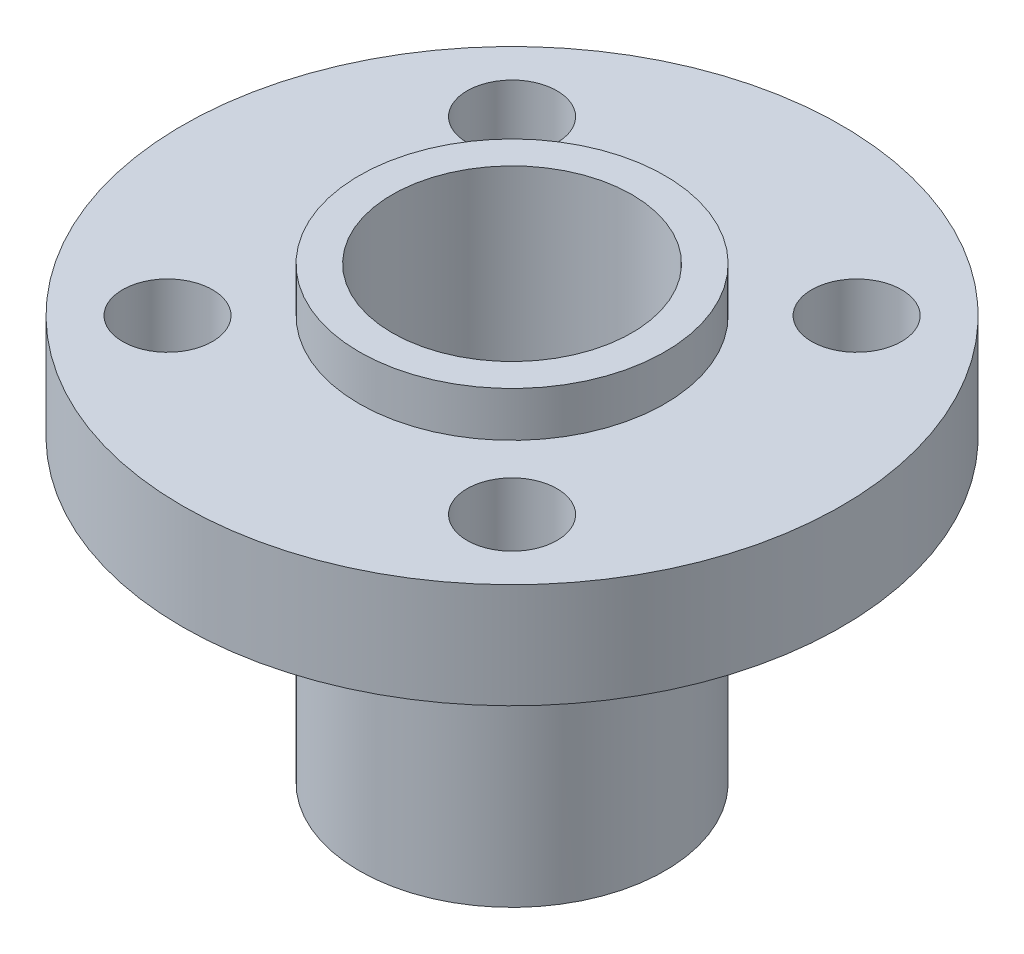
ISO-10303-21;
HEADER;
FILE_DESCRIPTION(('STEP AP214'),'2;1');
FILE_NAME('part.step','',(''),(''),'','','');
FILE_SCHEMA(('AUTOMOTIVE_DESIGN { 1 0 10303 214 1 1 1 1 }'));
ENDSEC;
DATA;
#1=APPLICATION_CONTEXT('core data for automotive mechanical design processes');
#2=APPLICATION_PROTOCOL_DEFINITION('international standard','automotive_design',2000,#1);
#3=PRODUCT_CONTEXT('',#1,'mechanical');
#4=PRODUCT('Part','Part','',(#3));
#5=PRODUCT_RELATED_PRODUCT_CATEGORY('part','',(#4));
#6=PRODUCT_DEFINITION_FORMATION('','',#4);
#7=PRODUCT_DEFINITION_CONTEXT('part definition',#1,'design');
#8=PRODUCT_DEFINITION('design','',#6,#7);
#9=PRODUCT_DEFINITION_SHAPE('','',#8);
#10=(LENGTH_UNIT() NAMED_UNIT(*) SI_UNIT(.MILLI.,.METRE.));
#11=(NAMED_UNIT(*) PLANE_ANGLE_UNIT() SI_UNIT($,.RADIAN.));
#12=(NAMED_UNIT(*) SI_UNIT($,.STERADIAN.) SOLID_ANGLE_UNIT());
#13=UNCERTAINTY_MEASURE_WITH_UNIT(LENGTH_MEASURE(1.E-05),#10,'distance_accuracy_value','');
#14=(GEOMETRIC_REPRESENTATION_CONTEXT(3) GLOBAL_UNCERTAINTY_ASSIGNED_CONTEXT((#13)) GLOBAL_UNIT_ASSIGNED_CONTEXT((#10,
#11,#12)) REPRESENTATION_CONTEXT('',''));
#15=CARTESIAN_POINT('',(0.,0.,0.));
#16=DIRECTION('',(0.,0.,1.));
#17=DIRECTION('',(1.,0.,0.));
#18=AXIS2_PLACEMENT_3D('',#15,#16,#17);
#19=CARTESIAN_POINT('',(0.,0.,0.));
#20=DIRECTION('',(0.,1.,0.));
#21=DIRECTION('',(0.,0.,1.));
#22=AXIS2_PLACEMENT_3D('',#19,#20,#21);
#23=PLANE('',#22);
#24=CARTESIAN_POINT('',(-5.75,0.,5.75));
#25=DIRECTION('',(0.,1.,0.));
#26=DIRECTION('',(0.,0.,1.));
#27=AXIS2_PLACEMENT_3D('',#24,#25,#26);
#28=CIRCLE('',#27,1.5);
#29=CARTESIAN_POINT('',(-5.75,0.,7.25));
#30=VERTEX_POINT('',#29);
#31=EDGE_CURVE('E77',#30,#30,#28,.F.);
#32=ORIENTED_EDGE('',*,*,#31,.F.);
#33=EDGE_LOOP('',(#32));
#34=FACE_BOUND('',#33,.T.);
#35=CARTESIAN_POINT('',(5.75,0.,5.75));
#36=DIRECTION('',(0.,1.,0.));
#37=DIRECTION('',(0.,0.,1.));
#38=AXIS2_PLACEMENT_3D('',#35,#36,#37);
#39=CIRCLE('',#38,1.5);
#40=CARTESIAN_POINT('',(5.75,0.,7.25));
#41=VERTEX_POINT('',#40);
#42=EDGE_CURVE('E82',#41,#41,#39,.F.);
#43=ORIENTED_EDGE('',*,*,#42,.F.);
#44=EDGE_LOOP('',(#43));
#45=FACE_BOUND('',#44,.T.);
#46=CARTESIAN_POINT('',(5.75,0.,-5.75));
#47=DIRECTION('',(0.,1.,0.));
#48=DIRECTION('',(0.,0.,1.));
#49=AXIS2_PLACEMENT_3D('',#46,#47,#48);
#50=CIRCLE('',#49,1.5);
#51=CARTESIAN_POINT('',(5.75,0.,-4.25));
#52=VERTEX_POINT('',#51);
#53=EDGE_CURVE('E73',#52,#52,#50,.F.);
#54=ORIENTED_EDGE('',*,*,#53,.F.);
#55=EDGE_LOOP('',(#54));
#56=FACE_BOUND('',#55,.T.);
#57=CARTESIAN_POINT('',(-5.75,0.,-5.75));
#58=DIRECTION('',(0.,1.,0.));
#59=DIRECTION('',(0.,0.,1.));
#60=AXIS2_PLACEMENT_3D('',#57,#58,#59);
#61=CIRCLE('',#60,1.5);
#62=CARTESIAN_POINT('',(-5.75,0.,-4.25));
#63=VERTEX_POINT('',#62);
#64=EDGE_CURVE('E70',#63,#63,#61,.F.);
#65=ORIENTED_EDGE('',*,*,#64,.F.);
#66=EDGE_LOOP('',(#65));
#67=FACE_BOUND('',#66,.T.);
#68=CARTESIAN_POINT('',(0.,0.,0.));
#69=DIRECTION('',(0.,1.,0.));
#70=DIRECTION('',(0.,0.,1.));
#71=AXIS2_PLACEMENT_3D('',#68,#69,#70);
#72=CIRCLE('',#71,11.);
#73=CARTESIAN_POINT('',(0.,0.,11.));
#74=VERTEX_POINT('',#73);
#75=EDGE_CURVE('E48',#74,#74,#72,.T.);
#76=ORIENTED_EDGE('',*,*,#75,.F.);
#77=EDGE_LOOP('',(#76));
#78=FACE_BOUND('',#77,.T.);
#79=CARTESIAN_POINT('',(0.,0.,0.));
#80=DIRECTION('',(0.,1.,0.));
#81=DIRECTION('',(0.,0.,1.));
#82=AXIS2_PLACEMENT_3D('',#79,#80,#81);
#83=CIRCLE('',#82,5.1);
#84=CARTESIAN_POINT('',(0.,0.,5.1));
#85=VERTEX_POINT('',#84);
#86=EDGE_CURVE('E10',#85,#85,#83,.F.);
#87=ORIENTED_EDGE('',*,*,#86,.F.);
#88=EDGE_LOOP('',(#87));
#89=FACE_BOUND('',#88,.T.);
#90=ADVANCED_FACE('F40',(#34,#45,#56,#67,#78,#89),#23,.F.);
#91=CARTESIAN_POINT('',(0.,3.5,0.));
#92=DIRECTION('',(0.,1.,0.));
#93=DIRECTION('',(0.,0.,1.));
#94=AXIS2_PLACEMENT_3D('',#91,#92,#93);
#95=PLANE('',#94);
#96=CARTESIAN_POINT('',(-5.75,3.5,5.75));
#97=DIRECTION('',(0.,1.,0.));
#98=DIRECTION('',(0.,0.,1.));
#99=AXIS2_PLACEMENT_3D('',#96,#97,#98);
#100=CIRCLE('',#99,1.5);
#101=CARTESIAN_POINT('',(-5.75,3.5,7.25));
#102=VERTEX_POINT('',#101);
#103=EDGE_CURVE('E78',#102,#102,#100,.T.);
#104=ORIENTED_EDGE('',*,*,#103,.F.);
#105=EDGE_LOOP('',(#104));
#106=FACE_BOUND('',#105,.T.);
#107=CARTESIAN_POINT('',(5.75,3.5,5.75));
#108=DIRECTION('',(0.,1.,0.));
#109=DIRECTION('',(0.,0.,1.));
#110=AXIS2_PLACEMENT_3D('',#107,#108,#109);
#111=CIRCLE('',#110,1.5);
#112=CARTESIAN_POINT('',(5.75,3.5,7.25));
#113=VERTEX_POINT('',#112);
#114=EDGE_CURVE('E76',#113,#113,#111,.T.);
#115=ORIENTED_EDGE('',*,*,#114,.F.);
#116=EDGE_LOOP('',(#115));
#117=FACE_BOUND('',#116,.T.);
#118=CARTESIAN_POINT('',(5.75,3.5,-5.75));
#119=DIRECTION('',(0.,1.,0.));
#120=DIRECTION('',(0.,0.,1.));
#121=AXIS2_PLACEMENT_3D('',#118,#119,#120);
#122=CIRCLE('',#121,1.5);
#123=CARTESIAN_POINT('',(5.75,3.5,-4.25));
#124=VERTEX_POINT('',#123);
#125=EDGE_CURVE('E88',#124,#124,#122,.T.);
#126=ORIENTED_EDGE('',*,*,#125,.F.);
#127=EDGE_LOOP('',(#126));
#128=FACE_BOUND('',#127,.T.);
#129=CARTESIAN_POINT('',(-5.75,3.5,-5.75));
#130=DIRECTION('',(0.,1.,0.));
#131=DIRECTION('',(0.,0.,1.));
#132=AXIS2_PLACEMENT_3D('',#129,#130,#131);
#133=CIRCLE('',#132,1.5);
#134=CARTESIAN_POINT('',(-5.75,3.5,-4.25));
#135=VERTEX_POINT('',#134);
#136=EDGE_CURVE('E75',#135,#135,#133,.T.);
#137=ORIENTED_EDGE('',*,*,#136,.F.);
#138=EDGE_LOOP('',(#137));
#139=FACE_BOUND('',#138,.T.);
#140=CARTESIAN_POINT('',(0.,3.5,0.));
#141=DIRECTION('',(0.,1.,0.));
#142=DIRECTION('',(0.,0.,1.));
#143=AXIS2_PLACEMENT_3D('',#140,#141,#142);
#144=CIRCLE('',#143,11.);
#145=CARTESIAN_POINT('',(0.,3.5,11.));
#146=VERTEX_POINT('',#145);
#147=EDGE_CURVE('E42',#146,#146,#144,.T.);
#148=ORIENTED_EDGE('',*,*,#147,.T.);
#149=EDGE_LOOP('',(#148));
#150=FACE_BOUND('',#149,.T.);
#151=CARTESIAN_POINT('',(0.,3.5,0.));
#152=DIRECTION('',(0.,1.,0.));
#153=DIRECTION('',(0.,0.,1.));
#154=AXIS2_PLACEMENT_3D('',#151,#152,#153);
#155=CIRCLE('',#154,5.1);
#156=CARTESIAN_POINT('',(0.,3.5,5.1));
#157=VERTEX_POINT('',#156);
#158=EDGE_CURVE('E54',#157,#157,#155,.T.);
#159=ORIENTED_EDGE('',*,*,#158,.F.);
#160=EDGE_LOOP('',(#159));
#161=FACE_BOUND('',#160,.T.);
#162=ADVANCED_FACE('F100',(#106,#117,#128,#139,#150,#161),#95,.T.);
#163=CARTESIAN_POINT('',(0.,3.5,0.));
#164=DIRECTION('',(0.,-1.,0.));
#165=DIRECTION('',(0.,0.,-1.));
#166=AXIS2_PLACEMENT_3D('',#163,#164,#165);
#167=CYLINDRICAL_SURFACE('',#166,11.);
#168=ORIENTED_EDGE('',*,*,#147,.F.);
#169=EDGE_LOOP('',(#168));
#170=FACE_BOUND('',#169,.T.);
#171=ORIENTED_EDGE('',*,*,#75,.T.);
#172=EDGE_LOOP('',(#171));
#173=FACE_BOUND('',#172,.T.);
#174=ADVANCED_FACE('F39',(#170,#173),#167,.T.);
#175=CARTESIAN_POINT('',(0.,3.5,0.));
#176=DIRECTION('',(0.,-1.,0.));
#177=DIRECTION('',(0.,0.,-1.));
#178=AXIS2_PLACEMENT_3D('',#175,#176,#177);
#179=CYLINDRICAL_SURFACE('',#178,4.);
#180=CARTESIAN_POINT('',(0.,5.,0.));
#181=DIRECTION('',(0.,1.,0.));
#182=DIRECTION('',(0.,0.,1.));
#183=AXIS2_PLACEMENT_3D('',#180,#181,#182);
#184=CIRCLE('',#183,4.);
#185=CARTESIAN_POINT('',(0.,5.,4.));
#186=VERTEX_POINT('',#185);
#187=EDGE_CURVE('E59',#186,#186,#184,.T.);
#188=ORIENTED_EDGE('',*,*,#187,.T.);
#189=EDGE_LOOP('',(#188));
#190=FACE_BOUND('',#189,.T.);
#191=CARTESIAN_POINT('',(0.,-10.,0.));
#192=DIRECTION('',(0.,-1.,0.));
#193=DIRECTION('',(0.,0.,-1.));
#194=AXIS2_PLACEMENT_3D('',#191,#192,#193);
#195=CIRCLE('',#194,4.);
#196=CARTESIAN_POINT('',(0.,-10.,-4.));
#197=VERTEX_POINT('',#196);
#198=EDGE_CURVE('E68',#197,#197,#195,.T.);
#199=ORIENTED_EDGE('',*,*,#198,.T.);
#200=EDGE_LOOP('',(#199));
#201=FACE_BOUND('',#200,.T.);
#202=ADVANCED_FACE('F118',(#190,#201),#179,.F.);
#203=CARTESIAN_POINT('',(0.,5.,0.));
#204=DIRECTION('',(0.,1.,0.));
#205=DIRECTION('',(0.,0.,1.));
#206=AXIS2_PLACEMENT_3D('',#203,#204,#205);
#207=PLANE('',#206);
#208=CARTESIAN_POINT('',(0.,5.,0.));
#209=DIRECTION('',(0.,1.,0.));
#210=DIRECTION('',(0.,0.,1.));
#211=AXIS2_PLACEMENT_3D('',#208,#209,#210);
#212=CIRCLE('',#211,5.1);
#213=CARTESIAN_POINT('',(0.,5.,5.1));
#214=VERTEX_POINT('',#213);
#215=EDGE_CURVE('E52',#214,#214,#212,.T.);
#216=ORIENTED_EDGE('',*,*,#215,.T.);
#217=EDGE_LOOP('',(#216));
#218=FACE_BOUND('',#217,.T.);
#219=ORIENTED_EDGE('',*,*,#187,.F.);
#220=EDGE_LOOP('',(#219));
#221=FACE_BOUND('',#220,.T.);
#222=ADVANCED_FACE('F108',(#218,#221),#207,.T.);
#223=CARTESIAN_POINT('',(0.,5.,0.));
#224=DIRECTION('',(0.,-1.,0.));
#225=DIRECTION('',(0.,0.,-1.));
#226=AXIS2_PLACEMENT_3D('',#223,#224,#225);
#227=CYLINDRICAL_SURFACE('',#226,5.1);
#228=ORIENTED_EDGE('',*,*,#215,.F.);
#229=EDGE_LOOP('',(#228));
#230=FACE_BOUND('',#229,.T.);
#231=ORIENTED_EDGE('',*,*,#158,.T.);
#232=EDGE_LOOP('',(#231));
#233=FACE_BOUND('',#232,.T.);
#234=ADVANCED_FACE('F106',(#230,#233),#227,.T.);
#235=CARTESIAN_POINT('',(0.,-10.,0.));
#236=DIRECTION('',(0.,-1.,0.));
#237=DIRECTION('',(0.,0.,-1.));
#238=AXIS2_PLACEMENT_3D('',#235,#236,#237);
#239=PLANE('',#238);
#240=CARTESIAN_POINT('',(0.,-10.,0.));
#241=DIRECTION('',(0.,-1.,0.));
#242=DIRECTION('',(0.,0.,-1.));
#243=AXIS2_PLACEMENT_3D('',#240,#241,#242);
#244=CIRCLE('',#243,5.1);
#245=CARTESIAN_POINT('',(0.,-10.,-5.1));
#246=VERTEX_POINT('',#245);
#247=EDGE_CURVE('E64',#246,#246,#244,.T.);
#248=ORIENTED_EDGE('',*,*,#247,.T.);
#249=EDGE_LOOP('',(#248));
#250=FACE_BOUND('',#249,.T.);
#251=ORIENTED_EDGE('',*,*,#198,.F.);
#252=EDGE_LOOP('',(#251));
#253=FACE_BOUND('',#252,.T.);
#254=ADVANCED_FACE('F107',(#250,#253),#239,.T.);
#255=CARTESIAN_POINT('',(0.,-10.,0.));
#256=DIRECTION('',(0.,1.,0.));
#257=DIRECTION('',(0.,0.,1.));
#258=AXIS2_PLACEMENT_3D('',#255,#256,#257);
#259=CYLINDRICAL_SURFACE('',#258,5.1);
#260=ORIENTED_EDGE('',*,*,#247,.F.);
#261=EDGE_LOOP('',(#260));
#262=FACE_BOUND('',#261,.T.);
#263=ORIENTED_EDGE('',*,*,#86,.T.);
#264=EDGE_LOOP('',(#263));
#265=FACE_BOUND('',#264,.T.);
#266=ADVANCED_FACE('F120',(#262,#265),#259,.T.);
#267=CARTESIAN_POINT('',(-5.75,-10.001,-5.75));
#268=DIRECTION('',(0.,1.,0.));
#269=DIRECTION('',(0.,0.,1.));
#270=AXIS2_PLACEMENT_3D('',#267,#268,#269);
#271=CYLINDRICAL_SURFACE('',#270,1.5);
#272=CARTESIAN_POINT('',(-5.75,3.5,-4.25));
#273=CARTESIAN_POINT('',(-5.75,3.46354166666667,-4.25));
#274=CARTESIAN_POINT('',(-5.75,3.42708333333333,-4.25));
#275=CARTESIAN_POINT('',(-5.75,3.35416666666667,-4.25));
#276=CARTESIAN_POINT('',(-5.75,3.31770833333333,-4.25));
#277=CARTESIAN_POINT('',(-5.75,3.24479166666667,-4.25));
#278=CARTESIAN_POINT('',(-5.75,3.20833333333333,-4.25));
#279=CARTESIAN_POINT('',(-5.75,3.13541666666667,-4.25));
#280=CARTESIAN_POINT('',(-5.75,3.09895833333333,-4.25));
#281=CARTESIAN_POINT('',(-5.75,3.02604166666667,-4.25));
#282=CARTESIAN_POINT('',(-5.75,2.98958333333333,-4.25));
#283=CARTESIAN_POINT('',(-5.75,2.91666666666667,-4.25));
#284=CARTESIAN_POINT('',(-5.75,2.88020833333333,-4.25));
#285=CARTESIAN_POINT('',(-5.75,2.80729166666667,-4.25));
#286=CARTESIAN_POINT('',(-5.75,2.77083333333333,-4.25));
#287=CARTESIAN_POINT('',(-5.75,2.69791666666667,-4.25));
#288=CARTESIAN_POINT('',(-5.75,2.66145833333333,-4.25));
#289=CARTESIAN_POINT('',(-5.75,2.58854166666667,-4.25));
#290=CARTESIAN_POINT('',(-5.75,2.55208333333333,-4.25));
#291=CARTESIAN_POINT('',(-5.75,2.47916666666667,-4.25));
#292=CARTESIAN_POINT('',(-5.75,2.44270833333333,-4.25));
#293=CARTESIAN_POINT('',(-5.75,2.36979166666667,-4.25));
#294=CARTESIAN_POINT('',(-5.75,2.33333333333333,-4.25));
#295=CARTESIAN_POINT('',(-5.75,2.26041666666667,-4.25));
#296=CARTESIAN_POINT('',(-5.75,2.22395833333333,-4.25));
#297=CARTESIAN_POINT('',(-5.75,2.15104166666667,-4.25));
#298=CARTESIAN_POINT('',(-5.75,2.11458333333333,-4.25));
#299=CARTESIAN_POINT('',(-5.75,2.04166666666667,-4.25));
#300=CARTESIAN_POINT('',(-5.75,2.00520833333333,-4.25));
#301=CARTESIAN_POINT('',(-5.75,1.93229166666667,-4.25));
#302=CARTESIAN_POINT('',(-5.75,1.89583333333333,-4.25));
#303=CARTESIAN_POINT('',(-5.75,1.82291666666667,-4.25));
#304=CARTESIAN_POINT('',(-5.75,1.78645833333333,-4.25));
#305=CARTESIAN_POINT('',(-5.75,1.71354166666667,-4.25));
#306=CARTESIAN_POINT('',(-5.75,1.67708333333333,-4.25));
#307=CARTESIAN_POINT('',(-5.75,1.60416666666667,-4.25));
#308=CARTESIAN_POINT('',(-5.75,1.56770833333333,-4.25));
#309=CARTESIAN_POINT('',(-5.75,1.49479166666667,-4.25));
#310=CARTESIAN_POINT('',(-5.75,1.45833333333333,-4.25));
#311=CARTESIAN_POINT('',(-5.75,1.38541666666667,-4.25));
#312=CARTESIAN_POINT('',(-5.75,1.34895833333333,-4.25));
#313=CARTESIAN_POINT('',(-5.75,1.27604166666667,-4.25));
#314=CARTESIAN_POINT('',(-5.75,1.23958333333333,-4.25));
#315=CARTESIAN_POINT('',(-5.75,1.16666666666667,-4.25));
#316=CARTESIAN_POINT('',(-5.75,1.13020833333333,-4.25));
#317=CARTESIAN_POINT('',(-5.75,1.05729166666667,-4.25));
#318=CARTESIAN_POINT('',(-5.75,1.02083333333333,-4.25));
#319=CARTESIAN_POINT('',(-5.75,0.947916666666666,-4.25));
#320=CARTESIAN_POINT('',(-5.75,0.911458333333332,-4.25));
#321=CARTESIAN_POINT('',(-5.75,0.838541666666666,-4.25));
#322=CARTESIAN_POINT('',(-5.75,0.802083333333332,-4.25));
#323=CARTESIAN_POINT('',(-5.75,0.729166666666666,-4.25));
#324=CARTESIAN_POINT('',(-5.75,0.692708333333332,-4.25));
#325=CARTESIAN_POINT('',(-5.75,0.619791666666666,-4.25));
#326=CARTESIAN_POINT('',(-5.75,0.583333333333332,-4.25));
#327=CARTESIAN_POINT('',(-5.75,0.510416666666665,-4.25));
#328=CARTESIAN_POINT('',(-5.75,0.473958333333332,-4.25));
#329=CARTESIAN_POINT('',(-5.75,0.401041666666665,-4.25));
#330=CARTESIAN_POINT('',(-5.75,0.364583333333332,-4.25));
#331=CARTESIAN_POINT('',(-5.75,0.291666666666665,-4.25));
#332=CARTESIAN_POINT('',(-5.75,0.255208333333332,-4.25));
#333=CARTESIAN_POINT('',(-5.75,0.182291666666665,-4.25));
#334=CARTESIAN_POINT('',(-5.75,0.145833333333332,-4.25));
#335=CARTESIAN_POINT('',(-5.75,0.072916666666665,-4.25));
#336=CARTESIAN_POINT('',(-5.75,0.0364583333333316,-4.25));
#337=CARTESIAN_POINT('',(-5.75,0.,-4.25));
#338=B_SPLINE_CURVE_WITH_KNOTS('',3,(#272,#273,#274,#275,#276,#277,#278,#279,#280,#281,#282,
#283,#284,#285,#286,#287,#288,#289,#290,#291,#292,#293,#294,#295,#296,#297,#298,#299,#300,#301,
#302,#303,#304,#305,#306,#307,#308,#309,#310,#311,#312,#313,#314,#315,#316,#317,#318,#319,#320,
#321,#322,#323,#324,#325,#326,#327,#328,#329,#330,#331,#332,#333,#334,#335,#336,#337),
.UNSPECIFIED.,.F.,.F.,(4,2,2,2,2,2,2,2,2,2,2,2,2,2,2,2,2,2,2,2,2,2,2,2,2,2,2,2,2,2,2,2,4),(0.,
0.109375,0.21875,0.328125,0.4375,0.546875,0.656250000000001,0.765625000000001,0.875000000000001,
0.984375000000001,1.09375,1.203125,1.3125,1.421875,1.53125,1.640625,1.75,1.859375,1.96875,
2.078125,2.1875,2.296875,2.40625,2.515625,2.625,2.734375,2.84375,2.953125,3.0625,3.171875,
3.28125,3.390625,3.5),.UNSPECIFIED.);
#339=EDGE_CURVE('BSEAM174',#135,#63,#338,.T.);
#340=ORIENTED_EDGE('',*,*,#136,.T.);
#341=ORIENTED_EDGE('',*,*,#64,.T.);
#342=ORIENTED_EDGE('',*,*,#339,.T.);
#343=ORIENTED_EDGE('',*,*,#339,.F.);
#344=EDGE_LOOP('',(#340,#342,#341,#343));
#345=FACE_BOUND('',#344,.T.);
#346=ADVANCED_FACE('F174',(#345),#271,.F.);
#347=CARTESIAN_POINT('',(5.75,-10.001,-5.75));
#348=DIRECTION('',(0.,1.,0.));
#349=DIRECTION('',(0.,0.,1.));
#350=AXIS2_PLACEMENT_3D('',#347,#348,#349);
#351=CYLINDRICAL_SURFACE('',#350,1.5);
#352=CARTESIAN_POINT('',(5.75,3.5,-4.25));
#353=CARTESIAN_POINT('',(5.75,3.46354166666667,-4.25));
#354=CARTESIAN_POINT('',(5.75,3.42708333333333,-4.25));
#355=CARTESIAN_POINT('',(5.75,3.35416666666667,-4.25));
#356=CARTESIAN_POINT('',(5.75,3.31770833333333,-4.25));
#357=CARTESIAN_POINT('',(5.75,3.24479166666667,-4.25));
#358=CARTESIAN_POINT('',(5.75,3.20833333333333,-4.25));
#359=CARTESIAN_POINT('',(5.75,3.13541666666667,-4.25));
#360=CARTESIAN_POINT('',(5.75,3.09895833333333,-4.25));
#361=CARTESIAN_POINT('',(5.75,3.02604166666667,-4.25));
#362=CARTESIAN_POINT('',(5.75,2.98958333333333,-4.25));
#363=CARTESIAN_POINT('',(5.75,2.91666666666667,-4.25));
#364=CARTESIAN_POINT('',(5.75,2.88020833333333,-4.25));
#365=CARTESIAN_POINT('',(5.75,2.80729166666667,-4.25));
#366=CARTESIAN_POINT('',(5.75,2.77083333333333,-4.25));
#367=CARTESIAN_POINT('',(5.75,2.69791666666667,-4.25));
#368=CARTESIAN_POINT('',(5.75,2.66145833333333,-4.25));
#369=CARTESIAN_POINT('',(5.75,2.58854166666667,-4.25));
#370=CARTESIAN_POINT('',(5.75,2.55208333333333,-4.25));
#371=CARTESIAN_POINT('',(5.75,2.47916666666667,-4.25));
#372=CARTESIAN_POINT('',(5.75,2.44270833333333,-4.25));
#373=CARTESIAN_POINT('',(5.75,2.36979166666667,-4.25));
#374=CARTESIAN_POINT('',(5.75,2.33333333333333,-4.25));
#375=CARTESIAN_POINT('',(5.75,2.26041666666667,-4.25));
#376=CARTESIAN_POINT('',(5.75,2.22395833333333,-4.25));
#377=CARTESIAN_POINT('',(5.75,2.15104166666667,-4.25));
#378=CARTESIAN_POINT('',(5.75,2.11458333333333,-4.25));
#379=CARTESIAN_POINT('',(5.75,2.04166666666667,-4.25));
#380=CARTESIAN_POINT('',(5.75,2.00520833333333,-4.25));
#381=CARTESIAN_POINT('',(5.75,1.93229166666667,-4.25));
#382=CARTESIAN_POINT('',(5.75,1.89583333333333,-4.25));
#383=CARTESIAN_POINT('',(5.75,1.82291666666667,-4.25));
#384=CARTESIAN_POINT('',(5.75,1.78645833333333,-4.25));
#385=CARTESIAN_POINT('',(5.75,1.71354166666667,-4.25));
#386=CARTESIAN_POINT('',(5.75,1.67708333333333,-4.25));
#387=CARTESIAN_POINT('',(5.75,1.60416666666667,-4.25));
#388=CARTESIAN_POINT('',(5.75,1.56770833333333,-4.25));
#389=CARTESIAN_POINT('',(5.75,1.49479166666667,-4.25));
#390=CARTESIAN_POINT('',(5.75,1.45833333333333,-4.25));
#391=CARTESIAN_POINT('',(5.75,1.38541666666667,-4.25));
#392=CARTESIAN_POINT('',(5.75,1.34895833333333,-4.25));
#393=CARTESIAN_POINT('',(5.75,1.27604166666667,-4.25));
#394=CARTESIAN_POINT('',(5.75,1.23958333333333,-4.25));
#395=CARTESIAN_POINT('',(5.75,1.16666666666667,-4.25));
#396=CARTESIAN_POINT('',(5.75,1.13020833333333,-4.25));
#397=CARTESIAN_POINT('',(5.75,1.05729166666667,-4.25));
#398=CARTESIAN_POINT('',(5.75,1.02083333333333,-4.25));
#399=CARTESIAN_POINT('',(5.75,0.947916666666666,-4.25));
#400=CARTESIAN_POINT('',(5.75,0.911458333333332,-4.25));
#401=CARTESIAN_POINT('',(5.75,0.838541666666666,-4.25));
#402=CARTESIAN_POINT('',(5.75,0.802083333333332,-4.25));
#403=CARTESIAN_POINT('',(5.75,0.729166666666666,-4.25));
#404=CARTESIAN_POINT('',(5.75,0.692708333333332,-4.25));
#405=CARTESIAN_POINT('',(5.75,0.619791666666666,-4.25));
#406=CARTESIAN_POINT('',(5.75,0.583333333333332,-4.25));
#407=CARTESIAN_POINT('',(5.75,0.510416666666665,-4.25));
#408=CARTESIAN_POINT('',(5.75,0.473958333333332,-4.25));
#409=CARTESIAN_POINT('',(5.75,0.401041666666665,-4.25));
#410=CARTESIAN_POINT('',(5.75,0.364583333333332,-4.25));
#411=CARTESIAN_POINT('',(5.75,0.291666666666665,-4.25));
#412=CARTESIAN_POINT('',(5.75,0.255208333333332,-4.25));
#413=CARTESIAN_POINT('',(5.75,0.182291666666665,-4.25));
#414=CARTESIAN_POINT('',(5.75,0.145833333333332,-4.25));
#415=CARTESIAN_POINT('',(5.75,0.072916666666665,-4.25));
#416=CARTESIAN_POINT('',(5.75,0.0364583333333316,-4.25));
#417=CARTESIAN_POINT('',(5.75,0.,-4.25));
#418=B_SPLINE_CURVE_WITH_KNOTS('',3,(#352,#353,#354,#355,#356,#357,#358,#359,#360,#361,#362,
#363,#364,#365,#366,#367,#368,#369,#370,#371,#372,#373,#374,#375,#376,#377,#378,#379,#380,#381,
#382,#383,#384,#385,#386,#387,#388,#389,#390,#391,#392,#393,#394,#395,#396,#397,#398,#399,#400,
#401,#402,#403,#404,#405,#406,#407,#408,#409,#410,#411,#412,#413,#414,#415,#416,#417),
.UNSPECIFIED.,.F.,.F.,(4,2,2,2,2,2,2,2,2,2,2,2,2,2,2,2,2,2,2,2,2,2,2,2,2,2,2,2,2,2,2,2,4),(0.,
0.109375,0.21875,0.328125,0.4375,0.546875,0.656250000000001,0.765625000000001,0.875000000000001,
0.984375000000001,1.09375,1.203125,1.3125,1.421875,1.53125,1.640625,1.75,1.859375,1.96875,
2.078125,2.1875,2.296875,2.40625,2.515625,2.625,2.734375,2.84375,2.953125,3.0625,3.171875,
3.28125,3.390625,3.5),.UNSPECIFIED.);
#419=EDGE_CURVE('BSEAM94',#124,#52,#418,.T.);
#420=ORIENTED_EDGE('',*,*,#125,.T.);
#421=ORIENTED_EDGE('',*,*,#53,.T.);
#422=ORIENTED_EDGE('',*,*,#419,.T.);
#423=ORIENTED_EDGE('',*,*,#419,.F.);
#424=EDGE_LOOP('',(#420,#422,#421,#423));
#425=FACE_BOUND('',#424,.T.);
#426=ADVANCED_FACE('F94',(#425),#351,.F.);
#427=CARTESIAN_POINT('',(5.75,-10.001,5.75));
#428=DIRECTION('',(0.,1.,0.));
#429=DIRECTION('',(0.,0.,1.));
#430=AXIS2_PLACEMENT_3D('',#427,#428,#429);
#431=CYLINDRICAL_SURFACE('',#430,1.5);
#432=CARTESIAN_POINT('',(5.75,3.5,7.25));
#433=CARTESIAN_POINT('',(5.75,3.46354166666667,7.25));
#434=CARTESIAN_POINT('',(5.75,3.42708333333333,7.25));
#435=CARTESIAN_POINT('',(5.75,3.35416666666667,7.25));
#436=CARTESIAN_POINT('',(5.75,3.31770833333333,7.25));
#437=CARTESIAN_POINT('',(5.75,3.24479166666667,7.25));
#438=CARTESIAN_POINT('',(5.75,3.20833333333333,7.25));
#439=CARTESIAN_POINT('',(5.75,3.13541666666667,7.25));
#440=CARTESIAN_POINT('',(5.75,3.09895833333333,7.25));
#441=CARTESIAN_POINT('',(5.75,3.02604166666667,7.25));
#442=CARTESIAN_POINT('',(5.75,2.98958333333333,7.25));
#443=CARTESIAN_POINT('',(5.75,2.91666666666667,7.25));
#444=CARTESIAN_POINT('',(5.75,2.88020833333333,7.25));
#445=CARTESIAN_POINT('',(5.75,2.80729166666667,7.25));
#446=CARTESIAN_POINT('',(5.75,2.77083333333333,7.25));
#447=CARTESIAN_POINT('',(5.75,2.69791666666667,7.25));
#448=CARTESIAN_POINT('',(5.75,2.66145833333333,7.25));
#449=CARTESIAN_POINT('',(5.75,2.58854166666667,7.25));
#450=CARTESIAN_POINT('',(5.75,2.55208333333333,7.25));
#451=CARTESIAN_POINT('',(5.75,2.47916666666667,7.25));
#452=CARTESIAN_POINT('',(5.75,2.44270833333333,7.25));
#453=CARTESIAN_POINT('',(5.75,2.36979166666667,7.25));
#454=CARTESIAN_POINT('',(5.75,2.33333333333333,7.25));
#455=CARTESIAN_POINT('',(5.75,2.26041666666667,7.25));
#456=CARTESIAN_POINT('',(5.75,2.22395833333333,7.25));
#457=CARTESIAN_POINT('',(5.75,2.15104166666667,7.25));
#458=CARTESIAN_POINT('',(5.75,2.11458333333333,7.25));
#459=CARTESIAN_POINT('',(5.75,2.04166666666667,7.25));
#460=CARTESIAN_POINT('',(5.75,2.00520833333333,7.25));
#461=CARTESIAN_POINT('',(5.75,1.93229166666667,7.25));
#462=CARTESIAN_POINT('',(5.75,1.89583333333333,7.25));
#463=CARTESIAN_POINT('',(5.75,1.82291666666667,7.25));
#464=CARTESIAN_POINT('',(5.75,1.78645833333333,7.25));
#465=CARTESIAN_POINT('',(5.75,1.71354166666667,7.25));
#466=CARTESIAN_POINT('',(5.75,1.67708333333333,7.25));
#467=CARTESIAN_POINT('',(5.75,1.60416666666667,7.25));
#468=CARTESIAN_POINT('',(5.75,1.56770833333333,7.25));
#469=CARTESIAN_POINT('',(5.75,1.49479166666667,7.25));
#470=CARTESIAN_POINT('',(5.75,1.45833333333333,7.25));
#471=CARTESIAN_POINT('',(5.75,1.38541666666667,7.25));
#472=CARTESIAN_POINT('',(5.75,1.34895833333333,7.25));
#473=CARTESIAN_POINT('',(5.75,1.27604166666667,7.25));
#474=CARTESIAN_POINT('',(5.75,1.23958333333333,7.25));
#475=CARTESIAN_POINT('',(5.75,1.16666666666667,7.25));
#476=CARTESIAN_POINT('',(5.75,1.13020833333333,7.25));
#477=CARTESIAN_POINT('',(5.75,1.05729166666667,7.25));
#478=CARTESIAN_POINT('',(5.75,1.02083333333333,7.25));
#479=CARTESIAN_POINT('',(5.75,0.947916666666666,7.25));
#480=CARTESIAN_POINT('',(5.75,0.911458333333332,7.25));
#481=CARTESIAN_POINT('',(5.75,0.838541666666666,7.25));
#482=CARTESIAN_POINT('',(5.75,0.802083333333332,7.25));
#483=CARTESIAN_POINT('',(5.75,0.729166666666666,7.25));
#484=CARTESIAN_POINT('',(5.75,0.692708333333332,7.25));
#485=CARTESIAN_POINT('',(5.75,0.619791666666666,7.25));
#486=CARTESIAN_POINT('',(5.75,0.583333333333332,7.25));
#487=CARTESIAN_POINT('',(5.75,0.510416666666665,7.25));
#488=CARTESIAN_POINT('',(5.75,0.473958333333332,7.25));
#489=CARTESIAN_POINT('',(5.75,0.401041666666665,7.25));
#490=CARTESIAN_POINT('',(5.75,0.364583333333332,7.25));
#491=CARTESIAN_POINT('',(5.75,0.291666666666665,7.25));
#492=CARTESIAN_POINT('',(5.75,0.255208333333332,7.25));
#493=CARTESIAN_POINT('',(5.75,0.182291666666665,7.25));
#494=CARTESIAN_POINT('',(5.75,0.145833333333332,7.25));
#495=CARTESIAN_POINT('',(5.75,0.072916666666665,7.25));
#496=CARTESIAN_POINT('',(5.75,0.0364583333333316,7.25));
#497=CARTESIAN_POINT('',(5.75,0.,7.25));
#498=B_SPLINE_CURVE_WITH_KNOTS('',3,(#432,#433,#434,#435,#436,#437,#438,#439,#440,#441,#442,
#443,#444,#445,#446,#447,#448,#449,#450,#451,#452,#453,#454,#455,#456,#457,#458,#459,#460,#461,
#462,#463,#464,#465,#466,#467,#468,#469,#470,#471,#472,#473,#474,#475,#476,#477,#478,#479,#480,
#481,#482,#483,#484,#485,#486,#487,#488,#489,#490,#491,#492,#493,#494,#495,#496,#497),
.UNSPECIFIED.,.F.,.F.,(4,2,2,2,2,2,2,2,2,2,2,2,2,2,2,2,2,2,2,2,2,2,2,2,2,2,2,2,2,2,2,2,4),(0.,
0.109375,0.21875,0.328125,0.4375,0.546875,0.656250000000001,0.765625000000001,0.875000000000001,
0.984375000000001,1.09375,1.203125,1.3125,1.421875,1.53125,1.640625,1.75,1.859375,1.96875,
2.078125,2.1875,2.296875,2.40625,2.515625,2.625,2.734375,2.84375,2.953125,3.0625,3.171875,
3.28125,3.390625,3.5),.UNSPECIFIED.);
#499=EDGE_CURVE('BSEAM189',#113,#41,#498,.T.);
#500=ORIENTED_EDGE('',*,*,#114,.T.);
#501=ORIENTED_EDGE('',*,*,#42,.T.);
#502=ORIENTED_EDGE('',*,*,#499,.T.);
#503=ORIENTED_EDGE('',*,*,#499,.F.);
#504=EDGE_LOOP('',(#500,#502,#501,#503));
#505=FACE_BOUND('',#504,.T.);
#506=ADVANCED_FACE('F189',(#505),#431,.F.);
#507=CARTESIAN_POINT('',(-5.75,-10.001,5.75));
#508=DIRECTION('',(0.,1.,0.));
#509=DIRECTION('',(0.,0.,1.));
#510=AXIS2_PLACEMENT_3D('',#507,#508,#509);
#511=CYLINDRICAL_SURFACE('',#510,1.5);
#512=CARTESIAN_POINT('',(-5.75,3.5,7.25));
#513=CARTESIAN_POINT('',(-5.75,3.46354166666667,7.25));
#514=CARTESIAN_POINT('',(-5.75,3.42708333333333,7.25));
#515=CARTESIAN_POINT('',(-5.75,3.35416666666667,7.25));
#516=CARTESIAN_POINT('',(-5.75,3.31770833333333,7.25));
#517=CARTESIAN_POINT('',(-5.75,3.24479166666667,7.25));
#518=CARTESIAN_POINT('',(-5.75,3.20833333333333,7.25));
#519=CARTESIAN_POINT('',(-5.75,3.13541666666667,7.25));
#520=CARTESIAN_POINT('',(-5.75,3.09895833333333,7.25));
#521=CARTESIAN_POINT('',(-5.75,3.02604166666667,7.25));
#522=CARTESIAN_POINT('',(-5.75,2.98958333333333,7.25));
#523=CARTESIAN_POINT('',(-5.75,2.91666666666667,7.25));
#524=CARTESIAN_POINT('',(-5.75,2.88020833333333,7.25));
#525=CARTESIAN_POINT('',(-5.75,2.80729166666667,7.25));
#526=CARTESIAN_POINT('',(-5.75,2.77083333333333,7.25));
#527=CARTESIAN_POINT('',(-5.75,2.69791666666667,7.25));
#528=CARTESIAN_POINT('',(-5.75,2.66145833333333,7.25));
#529=CARTESIAN_POINT('',(-5.75,2.58854166666667,7.25));
#530=CARTESIAN_POINT('',(-5.75,2.55208333333333,7.25));
#531=CARTESIAN_POINT('',(-5.75,2.47916666666667,7.25));
#532=CARTESIAN_POINT('',(-5.75,2.44270833333333,7.25));
#533=CARTESIAN_POINT('',(-5.75,2.36979166666667,7.25));
#534=CARTESIAN_POINT('',(-5.75,2.33333333333333,7.25));
#535=CARTESIAN_POINT('',(-5.75,2.26041666666667,7.25));
#536=CARTESIAN_POINT('',(-5.75,2.22395833333333,7.25));
#537=CARTESIAN_POINT('',(-5.75,2.15104166666667,7.25));
#538=CARTESIAN_POINT('',(-5.75,2.11458333333333,7.25));
#539=CARTESIAN_POINT('',(-5.75,2.04166666666667,7.25));
#540=CARTESIAN_POINT('',(-5.75,2.00520833333333,7.25));
#541=CARTESIAN_POINT('',(-5.75,1.93229166666667,7.25));
#542=CARTESIAN_POINT('',(-5.75,1.89583333333333,7.25));
#543=CARTESIAN_POINT('',(-5.75,1.82291666666667,7.25));
#544=CARTESIAN_POINT('',(-5.75,1.78645833333333,7.25));
#545=CARTESIAN_POINT('',(-5.75,1.71354166666667,7.25));
#546=CARTESIAN_POINT('',(-5.75,1.67708333333333,7.25));
#547=CARTESIAN_POINT('',(-5.75,1.60416666666667,7.25));
#548=CARTESIAN_POINT('',(-5.75,1.56770833333333,7.25));
#549=CARTESIAN_POINT('',(-5.75,1.49479166666667,7.25));
#550=CARTESIAN_POINT('',(-5.75,1.45833333333333,7.25));
#551=CARTESIAN_POINT('',(-5.75,1.38541666666667,7.25));
#552=CARTESIAN_POINT('',(-5.75,1.34895833333333,7.25));
#553=CARTESIAN_POINT('',(-5.75,1.27604166666667,7.25));
#554=CARTESIAN_POINT('',(-5.75,1.23958333333333,7.25));
#555=CARTESIAN_POINT('',(-5.75,1.16666666666667,7.25));
#556=CARTESIAN_POINT('',(-5.75,1.13020833333333,7.25));
#557=CARTESIAN_POINT('',(-5.75,1.05729166666667,7.25));
#558=CARTESIAN_POINT('',(-5.75,1.02083333333333,7.25));
#559=CARTESIAN_POINT('',(-5.75,0.947916666666666,7.25));
#560=CARTESIAN_POINT('',(-5.75,0.911458333333332,7.25));
#561=CARTESIAN_POINT('',(-5.75,0.838541666666666,7.25));
#562=CARTESIAN_POINT('',(-5.75,0.802083333333332,7.25));
#563=CARTESIAN_POINT('',(-5.75,0.729166666666666,7.25));
#564=CARTESIAN_POINT('',(-5.75,0.692708333333332,7.25));
#565=CARTESIAN_POINT('',(-5.75,0.619791666666666,7.25));
#566=CARTESIAN_POINT('',(-5.75,0.583333333333332,7.25));
#567=CARTESIAN_POINT('',(-5.75,0.510416666666665,7.25));
#568=CARTESIAN_POINT('',(-5.75,0.473958333333332,7.25));
#569=CARTESIAN_POINT('',(-5.75,0.401041666666665,7.25));
#570=CARTESIAN_POINT('',(-5.75,0.364583333333332,7.25));
#571=CARTESIAN_POINT('',(-5.75,0.291666666666665,7.25));
#572=CARTESIAN_POINT('',(-5.75,0.255208333333332,7.25));
#573=CARTESIAN_POINT('',(-5.75,0.182291666666665,7.25));
#574=CARTESIAN_POINT('',(-5.75,0.145833333333332,7.25));
#575=CARTESIAN_POINT('',(-5.75,0.072916666666665,7.25));
#576=CARTESIAN_POINT('',(-5.75,0.0364583333333316,7.25));
#577=CARTESIAN_POINT('',(-5.75,0.,7.25));
#578=B_SPLINE_CURVE_WITH_KNOTS('',3,(#512,#513,#514,#515,#516,#517,#518,#519,#520,#521,#522,
#523,#524,#525,#526,#527,#528,#529,#530,#531,#532,#533,#534,#535,#536,#537,#538,#539,#540,#541,
#542,#543,#544,#545,#546,#547,#548,#549,#550,#551,#552,#553,#554,#555,#556,#557,#558,#559,#560,
#561,#562,#563,#564,#565,#566,#567,#568,#569,#570,#571,#572,#573,#574,#575,#576,#577),
.UNSPECIFIED.,.F.,.F.,(4,2,2,2,2,2,2,2,2,2,2,2,2,2,2,2,2,2,2,2,2,2,2,2,2,2,2,2,2,2,2,2,4),(0.,
0.109375,0.21875,0.328125,0.4375,0.546875,0.656250000000001,0.765625000000001,0.875000000000001,
0.984375000000001,1.09375,1.203125,1.3125,1.421875,1.53125,1.640625,1.75,1.859375,1.96875,
2.078125,2.1875,2.296875,2.40625,2.515625,2.625,2.734375,2.84375,2.953125,3.0625,3.171875,
3.28125,3.390625,3.5),.UNSPECIFIED.);
#579=EDGE_CURVE('BSEAM191',#102,#30,#578,.T.);
#580=ORIENTED_EDGE('',*,*,#103,.T.);
#581=ORIENTED_EDGE('',*,*,#31,.T.);
#582=ORIENTED_EDGE('',*,*,#579,.T.);
#583=ORIENTED_EDGE('',*,*,#579,.F.);
#584=EDGE_LOOP('',(#580,#582,#581,#583));
#585=FACE_BOUND('',#584,.T.);
#586=ADVANCED_FACE('F191',(#585),#511,.F.);
#587=CLOSED_SHELL('',(#90,#162,#174,#202,#222,#234,#254,#266,#346,#426,#506,#586));
#588=MANIFOLD_SOLID_BREP('B2',#587);
#589=ADVANCED_BREP_SHAPE_REPRESENTATION('',(#18,#588),#14);
#590=SHAPE_DEFINITION_REPRESENTATION(#9,#589);
ENDSEC;
END-ISO-10303-21;
